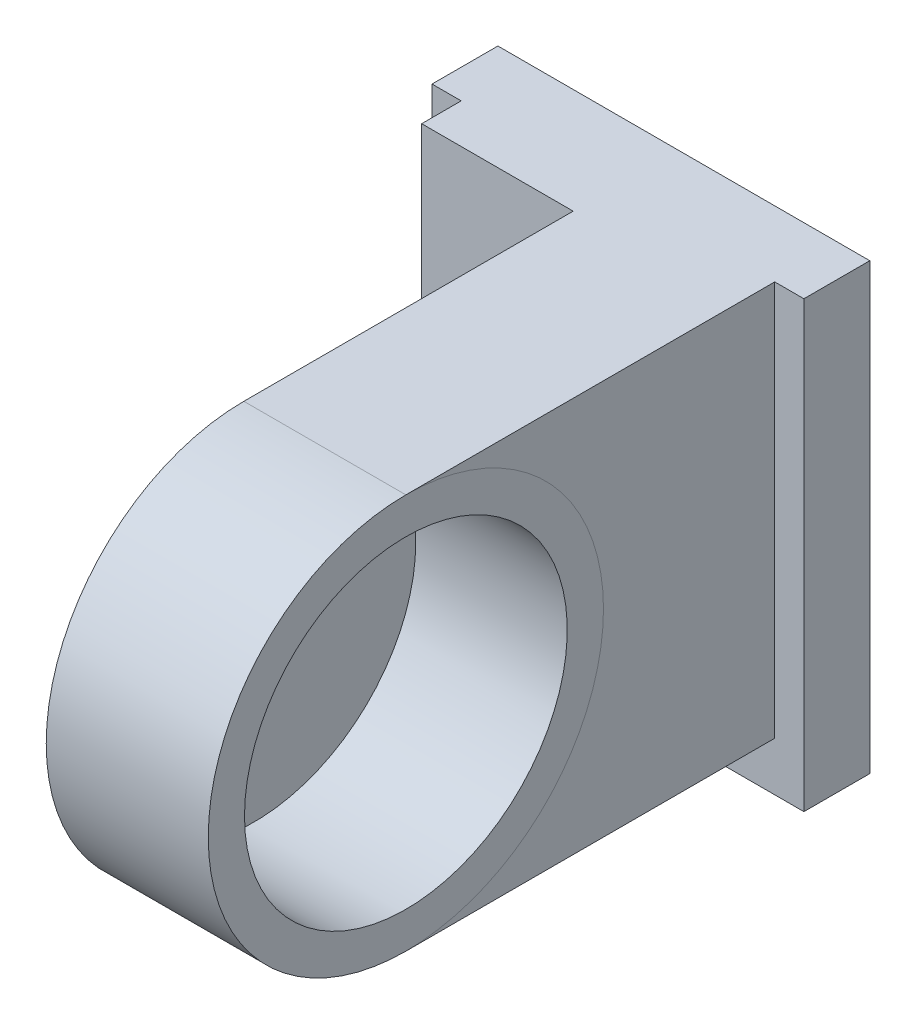
ISO-10303-21;
HEADER;
FILE_DESCRIPTION(('STEP AP214'),'2;1');
FILE_NAME('part.step','',(''),(''),'','','');
FILE_SCHEMA(('AUTOMOTIVE_DESIGN { 1 0 10303 214 1 1 1 1 }'));
ENDSEC;
DATA;
#1=APPLICATION_CONTEXT('core data for automotive mechanical design processes');
#2=APPLICATION_PROTOCOL_DEFINITION('international standard','automotive_design',2000,#1);
#3=PRODUCT_CONTEXT('',#1,'mechanical');
#4=PRODUCT('Part','Part','',(#3));
#5=PRODUCT_RELATED_PRODUCT_CATEGORY('part','',(#4));
#6=PRODUCT_DEFINITION_FORMATION('','',#4);
#7=PRODUCT_DEFINITION_CONTEXT('part definition',#1,'design');
#8=PRODUCT_DEFINITION('design','',#6,#7);
#9=PRODUCT_DEFINITION_SHAPE('','',#8);
#10=(LENGTH_UNIT() NAMED_UNIT(*) SI_UNIT(.MILLI.,.METRE.));
#11=(NAMED_UNIT(*) PLANE_ANGLE_UNIT() SI_UNIT($,.RADIAN.));
#12=(NAMED_UNIT(*) SI_UNIT($,.STERADIAN.) SOLID_ANGLE_UNIT());
#13=UNCERTAINTY_MEASURE_WITH_UNIT(LENGTH_MEASURE(1.E-05),#10,'distance_accuracy_value','');
#14=(GEOMETRIC_REPRESENTATION_CONTEXT(3) GLOBAL_UNCERTAINTY_ASSIGNED_CONTEXT((#13)) GLOBAL_UNIT_ASSIGNED_CONTEXT((#10,
#11,#12)) REPRESENTATION_CONTEXT('',''));
#15=CARTESIAN_POINT('',(0.,0.,0.));
#16=DIRECTION('',(0.,0.,1.));
#17=DIRECTION('',(1.,0.,0.));
#18=AXIS2_PLACEMENT_3D('',#15,#16,#17);
#19=CARTESIAN_POINT('',(23.8,15.,-30.));
#20=DIRECTION('',(-1.,0.,0.));
#21=DIRECTION('',(0.,0.,1.));
#22=AXIS2_PLACEMENT_3D('',#19,#20,#21);
#23=PLANE('',#22);
#24=DIRECTION('',(0.,-1.,0.));
#25=VECTOR('',#24,1.);
#26=CARTESIAN_POINT('',(23.8,15.,-28.));
#27=LINE('',#26,#25);
#28=CARTESIAN_POINT('',(23.8,15.,-28.));
#29=VERTEX_POINT('',#28);
#30=CARTESIAN_POINT('',(23.8,-15.,-28.));
#31=VERTEX_POINT('',#30);
#32=EDGE_CURVE('E353',#29,#31,#27,.T.);
#33=ORIENTED_EDGE('',*,*,#32,.F.);
#34=DIRECTION('',(0.,0.,1.));
#35=VECTOR('',#34,1.);
#36=CARTESIAN_POINT('',(23.8,15.,-30.));
#37=LINE('',#36,#35);
#38=CARTESIAN_POINT('',(23.8,15.,0.));
#39=VERTEX_POINT('',#38);
#40=EDGE_CURVE('E199',#29,#39,#37,.T.);
#41=ORIENTED_EDGE('',*,*,#40,.T.);
#42=CARTESIAN_POINT('',(23.8,0.,0.));
#43=DIRECTION('',(1.,0.,0.));
#44=DIRECTION('',(0.,0.,-1.));
#45=AXIS2_PLACEMENT_3D('',#42,#43,#44);
#46=CIRCLE('',#45,15.);
#47=CARTESIAN_POINT('',(23.8,-15.,0.));
#48=VERTEX_POINT('',#47);
#49=EDGE_CURVE('E188',#39,#48,#46,.F.);
#50=ORIENTED_EDGE('',*,*,#49,.T.);
#51=DIRECTION('',(0.,0.,1.));
#52=VECTOR('',#51,1.);
#53=CARTESIAN_POINT('',(23.8,-15.,-30.));
#54=LINE('',#53,#52);
#55=EDGE_CURVE('E190',#31,#48,#54,.T.);
#56=ORIENTED_EDGE('',*,*,#55,.F.);
#57=EDGE_LOOP('',(#33,#41,#50,#56));
#58=FACE_BOUND('',#57,.T.);
#59=ADVANCED_FACE('F49',(#58),#23,.F.);
#60=CARTESIAN_POINT('',(0.,-15.,-30.));
#61=DIRECTION('',(1.,0.,0.));
#62=DIRECTION('',(0.,0.,-1.));
#63=AXIS2_PLACEMENT_3D('',#60,#61,#62);
#64=PLANE('',#63);
#65=DIRECTION('',(0.,0.,1.));
#66=VECTOR('',#65,1.);
#67=CARTESIAN_POINT('',(0.,-15.,-30.));
#68=LINE('',#67,#66);
#69=CARTESIAN_POINT('',(0.,-15.,-28.));
#70=VERTEX_POINT('',#69);
#71=CARTESIAN_POINT('',(0.,-15.,-25.));
#72=VERTEX_POINT('',#71);
#73=EDGE_CURVE('E182',#70,#72,#68,.T.);
#74=ORIENTED_EDGE('',*,*,#73,.T.);
#75=DIRECTION('',(0.,-1.,0.));
#76=VECTOR('',#75,1.);
#77=CARTESIAN_POINT('',(0.,15.,-25.));
#78=LINE('',#77,#76);
#79=CARTESIAN_POINT('',(0.,15.,-25.));
#80=VERTEX_POINT('',#79);
#81=EDGE_CURVE('E167',#80,#72,#78,.T.);
#82=ORIENTED_EDGE('',*,*,#81,.F.);
#83=DIRECTION('',(0.,0.,1.));
#84=VECTOR('',#83,1.);
#85=CARTESIAN_POINT('',(0.,15.,-30.));
#86=LINE('',#85,#84);
#87=CARTESIAN_POINT('',(0.,15.,-28.));
#88=VERTEX_POINT('',#87);
#89=EDGE_CURVE('E180',#88,#80,#86,.T.);
#90=ORIENTED_EDGE('',*,*,#89,.F.);
#91=DIRECTION('',(0.,1.,0.));
#92=VECTOR('',#91,1.);
#93=CARTESIAN_POINT('',(0.,-15.,-28.));
#94=LINE('',#93,#92);
#95=EDGE_CURVE('E202',#70,#88,#94,.T.);
#96=ORIENTED_EDGE('',*,*,#95,.F.);
#97=EDGE_LOOP('',(#74,#82,#90,#96));
#98=FACE_BOUND('',#97,.T.);
#99=ADVANCED_FACE('F179',(#98),#64,.F.);
#100=CARTESIAN_POINT('',(23.8,-15.,-30.));
#101=DIRECTION('',(0.,1.,0.));
#102=DIRECTION('',(0.,0.,1.));
#103=AXIS2_PLACEMENT_3D('',#100,#101,#102);
#104=PLANE('',#103);
#105=DIRECTION('',(-1.,0.,0.));
#106=VECTOR('',#105,1.);
#107=CARTESIAN_POINT('',(4.,-15.,0.));
#108=LINE('',#107,#106);
#109=CARTESIAN_POINT('',(11.5,-15.,0.));
#110=VERTEX_POINT('',#109);
#111=EDGE_CURVE('E356',#110,#48,#108,.F.);
#112=ORIENTED_EDGE('',*,*,#111,.F.);
#113=DIRECTION('',(0.,0.,1.));
#114=VECTOR('',#113,1.);
#115=CARTESIAN_POINT('',(11.5,-15.,-25.));
#116=LINE('',#115,#114);
#117=CARTESIAN_POINT('',(11.5,-15.,-25.));
#118=VERTEX_POINT('',#117);
#119=EDGE_CURVE('E64',#118,#110,#116,.T.);
#120=ORIENTED_EDGE('',*,*,#119,.F.);
#121=DIRECTION('',(-1.,0.,0.));
#122=VECTOR('',#121,1.);
#123=CARTESIAN_POINT('',(62.9508707321241,-15.,-25.));
#124=LINE('',#123,#122);
#125=EDGE_CURVE('E219',#118,#72,#124,.T.);
#126=ORIENTED_EDGE('',*,*,#125,.T.);
#127=ORIENTED_EDGE('',*,*,#73,.F.);
#128=DIRECTION('',(-1.,0.,0.));
#129=VECTOR('',#128,1.);
#130=CARTESIAN_POINT('',(23.8,-15.,-28.));
#131=LINE('',#130,#129);
#132=EDGE_CURVE('E349',#31,#70,#131,.T.);
#133=ORIENTED_EDGE('',*,*,#132,.F.);
#134=ORIENTED_EDGE('',*,*,#55,.T.);
#135=EDGE_LOOP('',(#112,#120,#126,#127,#133,#134));
#136=FACE_BOUND('',#135,.T.);
#137=ADVANCED_FACE('F252',(#136),#104,.F.);
#138=CARTESIAN_POINT('',(23.8,15.,-30.));
#139=DIRECTION('',(0.,-1.,0.));
#140=DIRECTION('',(0.,0.,-1.));
#141=AXIS2_PLACEMENT_3D('',#138,#139,#140);
#142=PLANE('',#141);
#143=DIRECTION('',(-1.,0.,0.));
#144=VECTOR('',#143,1.);
#145=CARTESIAN_POINT('',(62.9508707321241,15.,-25.));
#146=LINE('',#145,#144);
#147=CARTESIAN_POINT('',(11.5,15.,-25.));
#148=VERTEX_POINT('',#147);
#149=EDGE_CURVE('E164',#148,#80,#146,.T.);
#150=ORIENTED_EDGE('',*,*,#149,.F.);
#151=DIRECTION('',(0.,0.,-1.));
#152=VECTOR('',#151,1.);
#153=CARTESIAN_POINT('',(11.5,15.,-25.));
#154=LINE('',#153,#152);
#155=CARTESIAN_POINT('',(11.5,15.,0.));
#156=VERTEX_POINT('',#155);
#157=EDGE_CURVE('E174',#156,#148,#154,.T.);
#158=ORIENTED_EDGE('',*,*,#157,.F.);
#159=DIRECTION('',(-1.,0.,0.));
#160=VECTOR('',#159,1.);
#161=CARTESIAN_POINT('',(4.,15.,0.));
#162=LINE('',#161,#160);
#163=EDGE_CURVE('E193',#156,#39,#162,.F.);
#164=ORIENTED_EDGE('',*,*,#163,.T.);
#165=ORIENTED_EDGE('',*,*,#40,.F.);
#166=DIRECTION('',(-1.,0.,0.));
#167=VECTOR('',#166,1.);
#168=CARTESIAN_POINT('',(23.8,15.,-28.));
#169=LINE('',#168,#167);
#170=CARTESIAN_POINT('',(26.0140137299771,15.,-28.));
#171=VERTEX_POINT('',#170);
#172=EDGE_CURVE('E312',#171,#29,#169,.T.);
#173=ORIENTED_EDGE('',*,*,#172,.F.);
#174=DIRECTION('',(0.,0.,1.));
#175=VECTOR('',#174,1.);
#176=CARTESIAN_POINT('',(26.0140137299771,15.,-28.));
#177=LINE('',#176,#175);
#178=CARTESIAN_POINT('',(26.0140137299771,15.,-33.));
#179=VERTEX_POINT('',#178);
#180=EDGE_CURVE('E309',#179,#171,#177,.T.);
#181=ORIENTED_EDGE('',*,*,#180,.F.);
#182=DIRECTION('',(1.,0.,0.));
#183=VECTOR('',#182,1.);
#184=CARTESIAN_POINT('',(26.0140137299771,15.,-33.));
#185=LINE('',#184,#183);
#186=CARTESIAN_POINT('',(-2.21401372997711,15.,-33.));
#187=VERTEX_POINT('',#186);
#188=EDGE_CURVE('E302',#187,#179,#185,.T.);
#189=ORIENTED_EDGE('',*,*,#188,.F.);
#190=DIRECTION('',(0.,0.,-1.));
#191=VECTOR('',#190,1.);
#192=CARTESIAN_POINT('',(-2.21401372997711,15.,-33.));
#193=LINE('',#192,#191);
#194=CARTESIAN_POINT('',(-2.21401372997711,15.,-28.));
#195=VERTEX_POINT('',#194);
#196=EDGE_CURVE('E316',#195,#187,#193,.T.);
#197=ORIENTED_EDGE('',*,*,#196,.F.);
#198=DIRECTION('',(-1.,0.,0.));
#199=VECTOR('',#198,1.);
#200=CARTESIAN_POINT('',(-2.21401372997711,15.,-28.));
#201=LINE('',#200,#199);
#202=EDGE_CURVE('E187',#88,#195,#201,.T.);
#203=ORIENTED_EDGE('',*,*,#202,.F.);
#204=ORIENTED_EDGE('',*,*,#89,.T.);
#205=EDGE_LOOP('',(#150,#158,#164,#165,#173,#181,#189,#197,#203,#204));
#206=FACE_BOUND('',#205,.T.);
#207=ADVANCED_FACE('F51',(#206),#142,.F.);
#208=CARTESIAN_POINT('',(4.,0.,0.));
#209=DIRECTION('',(-1.,0.,0.));
#210=DIRECTION('',(0.,0.,1.));
#211=AXIS2_PLACEMENT_3D('',#208,#209,#210);
#212=CYLINDRICAL_SURFACE('',#211,15.);
#213=CARTESIAN_POINT('',(11.5,0.,0.));
#214=DIRECTION('',(1.,0.,0.));
#215=DIRECTION('',(0.,0.,-1.));
#216=AXIS2_PLACEMENT_3D('',#213,#214,#215);
#217=CIRCLE('',#216,15.);
#218=EDGE_CURVE('E218',#110,#156,#217,.T.);
#219=ORIENTED_EDGE('',*,*,#218,.F.);
#220=ORIENTED_EDGE('',*,*,#111,.T.);
#221=ORIENTED_EDGE('',*,*,#49,.F.);
#222=ORIENTED_EDGE('',*,*,#163,.F.);
#223=EDGE_LOOP('',(#219,#220,#221,#222));
#224=FACE_BOUND('',#223,.T.);
#225=ADVANCED_FACE('F258',(#224),#212,.F.);
#226=CARTESIAN_POINT('',(0.,0.,-28.));
#227=DIRECTION('',(0.,0.,-1.));
#228=DIRECTION('',(-1.,0.,0.));
#229=AXIS2_PLACEMENT_3D('',#226,#227,#228);
#230=PLANE('',#229);
#231=DIRECTION('',(0.,-1.,0.));
#232=VECTOR('',#231,1.);
#233=CARTESIAN_POINT('',(26.0140137299771,6.72036613272311,-28.));
#234=LINE('',#233,#232);
#235=CARTESIAN_POINT('',(26.0140137299771,-18.7203661327231,-28.));
#236=VERTEX_POINT('',#235);
#237=EDGE_CURVE('E337',#171,#236,#234,.T.);
#238=ORIENTED_EDGE('',*,*,#237,.F.);
#239=ORIENTED_EDGE('',*,*,#172,.T.);
#240=ORIENTED_EDGE('',*,*,#32,.T.);
#241=ORIENTED_EDGE('',*,*,#132,.T.);
#242=ORIENTED_EDGE('',*,*,#95,.T.);
#243=ORIENTED_EDGE('',*,*,#202,.T.);
#244=DIRECTION('',(0.,1.,0.));
#245=VECTOR('',#244,1.);
#246=CARTESIAN_POINT('',(-2.21401372997711,6.72036613272311,-28.));
#247=LINE('',#246,#245);
#248=CARTESIAN_POINT('',(-2.21401372997712,-18.7203661327231,-28.));
#249=VERTEX_POINT('',#248);
#250=EDGE_CURVE('E343',#249,#195,#247,.T.);
#251=ORIENTED_EDGE('',*,*,#250,.F.);
#252=DIRECTION('',(-1.,0.,0.));
#253=VECTOR('',#252,1.);
#254=CARTESIAN_POINT('',(26.0140137299771,-18.7203661327231,-28.));
#255=LINE('',#254,#253);
#256=EDGE_CURVE('E340',#236,#249,#255,.T.);
#257=ORIENTED_EDGE('',*,*,#256,.F.);
#258=EDGE_LOOP('',(#238,#239,#240,#241,#242,#243,#251,#257));
#259=FACE_BOUND('',#258,.T.);
#260=ADVANCED_FACE('F261',(#259),#230,.F.);
#261=CARTESIAN_POINT('',(26.0140137299771,6.72036613272311,-28.));
#262=DIRECTION('',(1.,0.,0.));
#263=DIRECTION('',(0.,1.,0.));
#264=AXIS2_PLACEMENT_3D('',#261,#262,#263);
#265=PLANE('',#264);
#266=DIRECTION('',(0.,0.,-1.));
#267=VECTOR('',#266,1.);
#268=CARTESIAN_POINT('',(26.0140137299771,-18.7203661327231,-28.));
#269=LINE('',#268,#267);
#270=CARTESIAN_POINT('',(26.0140137299771,-18.7203661327231,-33.));
#271=VERTEX_POINT('',#270);
#272=EDGE_CURVE('E345',#236,#271,#269,.T.);
#273=ORIENTED_EDGE('',*,*,#272,.T.);
#274=DIRECTION('',(0.,-1.,0.));
#275=VECTOR('',#274,1.);
#276=CARTESIAN_POINT('',(26.0140137299771,6.72036613272311,-33.));
#277=LINE('',#276,#275);
#278=EDGE_CURVE('E326',#179,#271,#277,.T.);
#279=ORIENTED_EDGE('',*,*,#278,.F.);
#280=ORIENTED_EDGE('',*,*,#180,.T.);
#281=ORIENTED_EDGE('',*,*,#237,.T.);
#282=EDGE_LOOP('',(#273,#279,#280,#281));
#283=FACE_BOUND('',#282,.T.);
#284=ADVANCED_FACE('F263',(#283),#265,.T.);
#285=CARTESIAN_POINT('',(-2.21401372997711,6.72036613272311,-28.));
#286=DIRECTION('',(-1.,0.,0.));
#287=DIRECTION('',(0.,-1.,0.));
#288=AXIS2_PLACEMENT_3D('',#285,#286,#287);
#289=PLANE('',#288);
#290=DIRECTION('',(0.,-1.,0.));
#291=VECTOR('',#290,1.);
#292=CARTESIAN_POINT('',(-2.21401372997712,4.72036613272311,-30.));
#293=LINE('',#292,#291);
#294=CARTESIAN_POINT('',(-2.21401372997712,4.72036613272311,-30.));
#295=VERTEX_POINT('',#294);
#296=CARTESIAN_POINT('',(-2.21401372997712,-18.7203661327231,-30.));
#297=VERTEX_POINT('',#296);
#298=EDGE_CURVE('E381',#295,#297,#293,.T.);
#299=ORIENTED_EDGE('',*,*,#298,.T.);
#300=DIRECTION('',(0.,0.,-1.));
#301=VECTOR('',#300,1.);
#302=CARTESIAN_POINT('',(-2.21401372997712,-18.7203661327231,-28.));
#303=LINE('',#302,#301);
#304=EDGE_CURVE('E346',#249,#297,#303,.T.);
#305=ORIENTED_EDGE('',*,*,#304,.F.);
#306=ORIENTED_EDGE('',*,*,#250,.T.);
#307=ORIENTED_EDGE('',*,*,#196,.T.);
#308=DIRECTION('',(0.,1.,0.));
#309=VECTOR('',#308,1.);
#310=CARTESIAN_POINT('',(-2.21401372997711,6.72036613272311,-33.));
#311=LINE('',#310,#309);
#312=CARTESIAN_POINT('',(-2.21401372997712,4.72036613272311,-33.));
#313=VERTEX_POINT('',#312);
#314=EDGE_CURVE('E335',#313,#187,#311,.T.);
#315=ORIENTED_EDGE('',*,*,#314,.F.);
#316=DIRECTION('',(0.,0.,1.));
#317=VECTOR('',#316,1.);
#318=CARTESIAN_POINT('',(-2.21401372997712,4.72036613272311,-33.));
#319=LINE('',#318,#317);
#320=EDGE_CURVE('E377',#313,#295,#319,.T.);
#321=ORIENTED_EDGE('',*,*,#320,.T.);
#322=EDGE_LOOP('',(#299,#305,#306,#307,#315,#321));
#323=FACE_BOUND('',#322,.T.);
#324=ADVANCED_FACE('F266',(#323),#289,.T.);
#325=CARTESIAN_POINT('',(26.0140137299771,-18.7203661327231,-28.));
#326=DIRECTION('',(0.,-1.,0.));
#327=DIRECTION('',(0.,0.,-1.));
#328=AXIS2_PLACEMENT_3D('',#325,#326,#327);
#329=PLANE('',#328);
#330=DIRECTION('',(0.,0.,-1.));
#331=VECTOR('',#330,1.);
#332=CARTESIAN_POINT('',(24.0140137299771,-18.7203661327231,-30.));
#333=LINE('',#332,#331);
#334=CARTESIAN_POINT('',(24.0140137299771,-18.7203661327231,-30.));
#335=VERTEX_POINT('',#334);
#336=CARTESIAN_POINT('',(24.0140137299771,-18.7203661327231,-33.));
#337=VERTEX_POINT('',#336);
#338=EDGE_CURVE('E221',#335,#337,#333,.T.);
#339=ORIENTED_EDGE('',*,*,#338,.T.);
#340=DIRECTION('',(-1.,0.,0.));
#341=VECTOR('',#340,1.);
#342=CARTESIAN_POINT('',(26.0140137299771,-18.7203661327231,-33.));
#343=LINE('',#342,#341);
#344=EDGE_CURVE('E332',#271,#337,#343,.T.);
#345=ORIENTED_EDGE('',*,*,#344,.F.);
#346=ORIENTED_EDGE('',*,*,#272,.F.);
#347=ORIENTED_EDGE('',*,*,#256,.T.);
#348=ORIENTED_EDGE('',*,*,#304,.T.);
#349=DIRECTION('',(1.,0.,0.));
#350=VECTOR('',#349,1.);
#351=CARTESIAN_POINT('',(-2.21401372997712,-18.7203661327231,-30.));
#352=LINE('',#351,#350);
#353=EDGE_CURVE('E375',#297,#335,#352,.T.);
#354=ORIENTED_EDGE('',*,*,#353,.T.);
#355=EDGE_LOOP('',(#339,#345,#346,#347,#348,#354));
#356=FACE_BOUND('',#355,.T.);
#357=ADVANCED_FACE('F268',(#356),#329,.T.);
#358=CARTESIAN_POINT('',(0.,0.,-33.));
#359=DIRECTION('',(0.,0.,-1.));
#360=DIRECTION('',(-1.,0.,0.));
#361=AXIS2_PLACEMENT_3D('',#358,#359,#360);
#362=PLANE('',#361);
#363=ORIENTED_EDGE('',*,*,#344,.T.);
#364=DIRECTION('',(0.,-1.,0.));
#365=VECTOR('',#364,1.);
#366=CARTESIAN_POINT('',(24.0140137299771,4.72036613272311,-33.));
#367=LINE('',#366,#365);
#368=CARTESIAN_POINT('',(24.0140137299771,3.72036613272311,-33.));
#369=VERTEX_POINT('',#368);
#370=EDGE_CURVE('E324',#369,#337,#367,.T.);
#371=ORIENTED_EDGE('',*,*,#370,.F.);
#372=CARTESIAN_POINT('',(24.0140137299771,4.72036613272311,-33.));
#373=DIRECTION('',(0.,0.,-1.));
#374=DIRECTION('',(-1.,0.,0.));
#375=AXIS2_PLACEMENT_3D('',#372,#373,#374);
#376=CIRCLE('',#375,1.);
#377=CARTESIAN_POINT('',(23.0140137299771,4.72036613272311,-33.));
#378=VERTEX_POINT('',#377);
#379=EDGE_CURVE('E383',#378,#369,#376,.T.);
#380=ORIENTED_EDGE('',*,*,#379,.F.);
#381=DIRECTION('',(1.,0.,0.));
#382=VECTOR('',#381,1.);
#383=CARTESIAN_POINT('',(-0.214013729977118,4.72036613272311,-33.));
#384=LINE('',#383,#382);
#385=EDGE_CURVE('E319',#313,#378,#384,.T.);
#386=ORIENTED_EDGE('',*,*,#385,.F.);
#387=ORIENTED_EDGE('',*,*,#314,.T.);
#388=ORIENTED_EDGE('',*,*,#188,.T.);
#389=ORIENTED_EDGE('',*,*,#278,.T.);
#390=EDGE_LOOP('',(#363,#371,#380,#386,#387,#388,#389));
#391=FACE_BOUND('',#390,.T.);
#392=ADVANCED_FACE('F271',(#391),#362,.T.);
#393=CARTESIAN_POINT('',(-0.214013729977118,4.72036613272311,-30.));
#394=DIRECTION('',(0.,1.,0.));
#395=DIRECTION('',(0.,0.,1.));
#396=AXIS2_PLACEMENT_3D('',#393,#394,#395);
#397=PLANE('',#396);
#398=ORIENTED_EDGE('',*,*,#385,.T.);
#399=DIRECTION('',(0.,0.,-1.));
#400=VECTOR('',#399,1.);
#401=CARTESIAN_POINT('',(23.0140137299771,4.72036613272311,-27.1715728752538));
#402=LINE('',#401,#400);
#403=CARTESIAN_POINT('',(23.0140137299771,4.72036613272311,-30.));
#404=VERTEX_POINT('',#403);
#405=EDGE_CURVE('E300',#378,#404,#402,.F.);
#406=ORIENTED_EDGE('',*,*,#405,.T.);
#407=DIRECTION('',(1.,0.,0.));
#408=VECTOR('',#407,1.);
#409=CARTESIAN_POINT('',(-0.214013729977118,4.72036613272311,-30.));
#410=LINE('',#409,#408);
#411=EDGE_CURVE('E296',#295,#404,#410,.T.);
#412=ORIENTED_EDGE('',*,*,#411,.F.);
#413=ORIENTED_EDGE('',*,*,#320,.F.);
#414=EDGE_LOOP('',(#398,#406,#412,#413));
#415=FACE_BOUND('',#414,.T.);
#416=ADVANCED_FACE('F281',(#415),#397,.F.);
#417=CARTESIAN_POINT('',(24.0140137299771,4.72036613272311,-30.));
#418=DIRECTION('',(1.,0.,0.));
#419=DIRECTION('',(0.,0.,-1.));
#420=AXIS2_PLACEMENT_3D('',#417,#418,#419);
#421=PLANE('',#420);
#422=DIRECTION('',(0.,-1.,0.));
#423=VECTOR('',#422,1.);
#424=CARTESIAN_POINT('',(24.0140137299771,4.72036613272311,-30.));
#425=LINE('',#424,#423);
#426=CARTESIAN_POINT('',(24.0140137299771,3.72036613272311,-30.));
#427=VERTEX_POINT('',#426);
#428=EDGE_CURVE('E323',#427,#335,#425,.T.);
#429=ORIENTED_EDGE('',*,*,#428,.F.);
#430=DIRECTION('',(0.,0.,-1.));
#431=VECTOR('',#430,1.);
#432=CARTESIAN_POINT('',(24.0140137299771,3.72036613272311,-27.1715728752538));
#433=LINE('',#432,#431);
#434=EDGE_CURVE('E305',#427,#369,#433,.T.);
#435=ORIENTED_EDGE('',*,*,#434,.T.);
#436=ORIENTED_EDGE('',*,*,#370,.T.);
#437=ORIENTED_EDGE('',*,*,#338,.F.);
#438=EDGE_LOOP('',(#429,#435,#436,#437));
#439=FACE_BOUND('',#438,.T.);
#440=ADVANCED_FACE('F285',(#439),#421,.F.);
#441=CARTESIAN_POINT('',(0.,0.,-30.));
#442=DIRECTION('',(0.,0.,-1.));
#443=DIRECTION('',(-1.,0.,0.));
#444=AXIS2_PLACEMENT_3D('',#441,#442,#443);
#445=PLANE('',#444);
#446=ORIENTED_EDGE('',*,*,#411,.T.);
#447=CARTESIAN_POINT('',(24.0140137299771,4.72036613272311,-30.));
#448=DIRECTION('',(0.,0.,-1.));
#449=DIRECTION('',(-1.,0.,0.));
#450=AXIS2_PLACEMENT_3D('',#447,#448,#449);
#451=CIRCLE('',#450,1.);
#452=EDGE_CURVE('E385',#427,#404,#451,.F.);
#453=ORIENTED_EDGE('',*,*,#452,.F.);
#454=ORIENTED_EDGE('',*,*,#428,.T.);
#455=ORIENTED_EDGE('',*,*,#353,.F.);
#456=ORIENTED_EDGE('',*,*,#298,.F.);
#457=EDGE_LOOP('',(#446,#453,#454,#455,#456));
#458=FACE_BOUND('',#457,.T.);
#459=CARTESIAN_POINT('',(11.9,-5.99999999999999,-30.));
#460=DIRECTION('',(0.,0.,-1.));
#461=DIRECTION('',(-1.,0.,0.));
#462=AXIS2_PLACEMENT_3D('',#459,#460,#461);
#463=CIRCLE('',#462,1.64999999999999);
#464=CARTESIAN_POINT('',(10.25,-5.99999999999999,-30.));
#465=VERTEX_POINT('',#464);
#466=EDGE_CURVE('E299',#465,#465,#463,.T.);
#467=ORIENTED_EDGE('',*,*,#466,.F.);
#468=EDGE_LOOP('',(#467));
#469=FACE_BOUND('',#468,.T.);
#470=ADVANCED_FACE('F245',(#458,#469),#445,.T.);
#471=CARTESIAN_POINT('',(11.9,-5.99999999999999,-19.9));
#472=DIRECTION('',(0.,0.,-1.));
#473=DIRECTION('',(-1.,0.,0.));
#474=AXIS2_PLACEMENT_3D('',#471,#472,#473);
#475=CONICAL_SURFACE('',#474,1.65,1.02974425867665);
#476=CARTESIAN_POINT('',(11.9,-5.99999999999999,-18.9085799786045));
#477=VERTEX_POINT('',#476);
#478=VERTEX_LOOP('',#477);
#479=FACE_BOUND('',#478,.T.);
#480=CARTESIAN_POINT('',(11.9,-5.99999999999999,-19.9));
#481=DIRECTION('',(0.,0.,-1.));
#482=DIRECTION('',(-1.,0.,0.));
#483=AXIS2_PLACEMENT_3D('',#480,#481,#482);
#484=CIRCLE('',#483,1.65);
#485=CARTESIAN_POINT('',(11.5,-4.39921894064179,-19.9));
#486=VERTEX_POINT('',#485);
#487=CARTESIAN_POINT('',(11.5,-7.6007810593582,-19.9));
#488=VERTEX_POINT('',#487);
#489=EDGE_CURVE('E212',#486,#488,#484,.T.);
#490=ORIENTED_EDGE('',*,*,#489,.T.);
#491=CARTESIAN_POINT('',(11.5,-11.0959094565305,-21.9799296343655));
#492=CARTESIAN_POINT('',(11.5,-10.8899420835726,-21.8565564729114));
#493=CARTESIAN_POINT('',(11.5,-10.6839587088977,-21.733210007237));
#494=CARTESIAN_POINT('',(11.5,-10.2719303982469,-21.486617523826));
#495=CARTESIAN_POINT('',(11.5,-10.0658854619575,-21.3633715066133));
#496=CARTESIAN_POINT('',(11.5,-9.65372006695948,-21.1170363022598));
#497=CARTESIAN_POINT('',(11.5,-9.44759961406344,-20.9939471054002));
#498=CARTESIAN_POINT('',(11.5,-9.0352078331686,-20.7480237630582));
#499=CARTESIAN_POINT('',(11.5,-8.82893650579443,-20.6251896165278));
#500=CARTESIAN_POINT('',(11.5,-8.40836563956159,-20.3753595928371));
#501=CARTESIAN_POINT('',(11.5,-8.19405586435979,-20.2483808968517));
#502=CARTESIAN_POINT('',(11.5,-7.87207777430335,-20.0587604916527));
#503=CARTESIAN_POINT('',(11.5,-7.76466097189649,-19.9956919369952));
#504=CARTESIAN_POINT('',(11.5,-7.54954691974332,-19.8700391825605));
#505=CARTESIAN_POINT('',(11.5,-7.44184967674577,-19.8074549712689));
#506=CARTESIAN_POINT('',(11.5,-7.2772832350475,-19.7127450287922));
#507=CARTESIAN_POINT('',(11.5,-7.22060323403768,-19.6802908538735));
#508=CARTESIAN_POINT('',(11.5,-7.10703240582595,-19.6157539159112));
#509=CARTESIAN_POINT('',(11.5,-7.05014158097183,-19.5836711487478));
#510=CARTESIAN_POINT('',(11.5,-6.93604242945231,-19.520078151245));
#511=CARTESIAN_POINT('',(11.5,-6.87883411152538,-19.4885679052489));
#512=CARTESIAN_POINT('',(11.5,-6.76391771442571,-19.4264802546729));
#513=CARTESIAN_POINT('',(11.5,-6.70620970266667,-19.3959027267017));
#514=CARTESIAN_POINT('',(11.5,-6.61631789788722,-19.3499469450673));
#515=CARTESIAN_POINT('',(11.5,-6.58444119824733,-19.3339709930333));
#516=CARTESIAN_POINT('',(11.5,-6.52032583255704,-19.302765974528));
#517=CARTESIAN_POINT('',(11.5,-6.48808719565185,-19.2875368484408));
#518=CARTESIAN_POINT('',(11.5,-6.42301234121299,-19.2581532564803));
#519=CARTESIAN_POINT('',(11.5,-6.39017478301928,-19.2440017007919));
#520=CARTESIAN_POINT('',(11.5,-6.32381470865599,-19.2174481274386));
#521=CARTESIAN_POINT('',(11.5,-6.29029247236088,-19.2050454106654));
#522=CARTESIAN_POINT('',(11.5,-6.21334346956224,-19.1801090293932));
#523=CARTESIAN_POINT('',(11.5,-6.16962444187895,-19.1683937790061));
#524=CARTESIAN_POINT('',(11.5,-6.10322348071672,-19.1564789061711));
#525=CARTESIAN_POINT('',(11.5,-6.08105883576431,-19.1534514593982));
#526=CARTESIAN_POINT('',(11.5,-6.03653870711945,-19.1495626189115));
#527=CARTESIAN_POINT('',(11.5,-6.01418328082353,-19.1487005952862));
#528=CARTESIAN_POINT('',(11.5,-5.96940982315351,-19.1492489325821));
#529=CARTESIAN_POINT('',(11.5,-5.94699191138099,-19.1506686339729));
#530=CARTESIAN_POINT('',(11.5,-5.90238935836394,-19.1556250833057));
#531=CARTESIAN_POINT('',(11.5,-5.88020483211097,-19.1591628292919));
#532=CARTESIAN_POINT('',(11.5,-5.83595331136222,-19.1680446685122));
#533=CARTESIAN_POINT('',(11.5,-5.81389038042621,-19.1734084487115));
#534=CARTESIAN_POINT('',(11.5,-5.77015983881541,-19.18553131197));
#535=CARTESIAN_POINT('',(11.5,-5.74849222958235,-19.1922904001167));
#536=CARTESIAN_POINT('',(11.5,-5.6818313040473,-19.2148563835935));
#537=CARTESIAN_POINT('',(11.5,-5.63744320467461,-19.2324264374258));
#538=CARTESIAN_POINT('',(11.5,-5.54970471151687,-19.2700119706729));
#539=CARTESIAN_POINT('',(11.5,-5.50635560147531,-19.2900303058485));
#540=CARTESIAN_POINT('',(11.5,-5.42022328204225,-19.3315276174584));
#541=CARTESIAN_POINT('',(11.5,-5.37744188456341,-19.3530103373799));
#542=CARTESIAN_POINT('',(11.5,-5.29232419328212,-19.3968436883249));
#543=CARTESIAN_POINT('',(11.5,-5.24998795629457,-19.4191944284639));
#544=CARTESIAN_POINT('',(11.5,-5.12298455076178,-19.487301600781));
#545=CARTESIAN_POINT('',(11.5,-5.03876523015261,-19.5338902937822));
#546=CARTESIAN_POINT('',(11.5,-4.87107336171103,-19.628013256346));
#547=CARTESIAN_POINT('',(11.5,-4.78759970297044,-19.6755455714397));
#548=CARTESIAN_POINT('',(11.5,-4.62300458511196,-19.7700430945898));
#549=CARTESIAN_POINT('',(11.5,-4.54187505045948,-19.8169942286682));
#550=CARTESIAN_POINT('',(11.5,-4.37981684390112,-19.9112407623298));
#551=CARTESIAN_POINT('',(11.5,-4.29888817183315,-19.9585361616351));
#552=CARTESIAN_POINT('',(11.5,-4.05629199228427,-20.1007579593746));
#553=CARTESIAN_POINT('',(11.5,-3.89481954680061,-20.1960169326609));
#554=CARTESIAN_POINT('',(11.5,-3.57198435728776,-20.3870518193593));
#555=CARTESIAN_POINT('',(11.5,-3.41062184425889,-20.4828281221286));
#556=CARTESIAN_POINT('',(11.5,-3.08804892094551,-20.6746317952791));
#557=CARTESIAN_POINT('',(11.5,-2.92683850871474,-20.7706591623869));
#558=CARTESIAN_POINT('',(11.5,-2.61035724210898,-20.9593832943513));
#559=CARTESIAN_POINT('',(11.5,-2.45508307579562,-21.0520745087289));
#560=CARTESIAN_POINT('',(11.5,-2.14459267013447,-21.2375554158571));
#561=CARTESIAN_POINT('',(11.5,-1.98937643103819,-21.3303451090288));
#562=CARTESIAN_POINT('',(11.5,-1.67913120110516,-21.5159057041715));
#563=CARTESIAN_POINT('',(11.5,-1.52410217160733,-21.6086765415152));
#564=CARTESIAN_POINT('',(11.5,-1.21407553428509,-21.7942691111999));
#565=CARTESIAN_POINT('',(11.5,-1.05907792632128,-21.8870908433081));
#566=CARTESIAN_POINT('',(11.5,-0.904090543469489,-21.9799296343655));
#567=B_SPLINE_CURVE_WITH_KNOTS('',3,(#491,#492,#493,#494,#495,#496,#497,#498,#499,#500,#501,
#502,#503,#504,#505,#506,#507,#508,#509,#510,#511,#512,#513,#514,#515,#516,#517,#518,#519,#520,
#521,#522,#523,#524,#525,#526,#527,#528,#529,#530,#531,#532,#533,#534,#535,#536,#537,#538,#539,
#540,#541,#542,#543,#544,#545,#546,#547,#548,#549,#550,#551,#552,#553,#554,#555,#556,#557,#558,
#559,#560,#561,#562,#563,#564,#565,#566),.UNSPECIFIED.,.F.,.F.,(4,2,2,2,2,2,2,2,2,2,2,2,2,2,2,2,
2,2,2,2,2,2,2,2,2,2,2,2,2,2,2,2,2,2,2,2,2,4),(0.,0.720271801661051,1.44054733611591,
2.16077581960693,2.88100133802571,3.62830793810705,4.00199734207743,4.37567783488629,
4.57161851899064,4.76755702755778,4.96349016972436,5.15939727808679,5.26635859285771,
5.37331135541985,5.48054341105366,5.58773247778698,5.72302779964851,5.79004831565875,
5.8570493334564,5.92432532591329,5.99163304448157,6.05969069921125,6.12774860209784,
6.27079771803543,6.41401531197478,6.55761384600998,6.70123049004436,6.98994945397052,
7.27812250485975,7.55932823147494,7.84053373108577,8.40296284331975,8.96590021268225,
9.52883027835702,10.0713388168314,10.6138496840373,11.1558495395777,11.6978469357066),.UNSPECIFIED.);
#568=EDGE_CURVE('E215',#488,#486,#567,.T.);
#569=ORIENTED_EDGE('',*,*,#568,.T.);
#570=EDGE_LOOP('',(#490,#569));
#571=FACE_BOUND('',#570,.T.);
#572=ADVANCED_FACE('F217',(#479,#571),#475,.F.);
#573=CARTESIAN_POINT('',(11.9,-5.99999999999999,-30.));
#574=DIRECTION('',(0.,0.,-1.));
#575=DIRECTION('',(-1.,0.,0.));
#576=AXIS2_PLACEMENT_3D('',#573,#574,#575);
#577=CYLINDRICAL_SURFACE('',#576,1.64999999999999);
#578=CARTESIAN_POINT('',(11.9,-5.99999999999999,-25.));
#579=DIRECTION('',(0.,0.,-1.));
#580=DIRECTION('',(0.,1.,0.));
#581=AXIS2_PLACEMENT_3D('',#578,#579,#580);
#582=CIRCLE('',#581,1.64999999999999);
#583=CARTESIAN_POINT('',(11.5,-4.39921894064179,-25.));
#584=VERTEX_POINT('',#583);
#585=CARTESIAN_POINT('',(11.5,-7.6007810593582,-25.));
#586=VERTEX_POINT('',#585);
#587=EDGE_CURVE('E204',#584,#586,#582,.F.);
#588=ORIENTED_EDGE('',*,*,#587,.T.);
#589=DIRECTION('',(0.,0.,-1.));
#590=VECTOR('',#589,1.);
#591=CARTESIAN_POINT('',(11.5,-7.6007810593582,-30.));
#592=LINE('',#591,#590);
#593=EDGE_CURVE('E12',#586,#488,#592,.F.);
#594=ORIENTED_EDGE('',*,*,#593,.T.);
#595=ORIENTED_EDGE('',*,*,#489,.F.);
#596=DIRECTION('',(0.,0.,-1.));
#597=VECTOR('',#596,1.);
#598=CARTESIAN_POINT('',(11.5,-4.39921894064179,-30.));
#599=LINE('',#598,#597);
#600=EDGE_CURVE('E57',#486,#584,#599,.T.);
#601=ORIENTED_EDGE('',*,*,#600,.T.);
#602=EDGE_LOOP('',(#588,#594,#595,#601));
#603=FACE_BOUND('',#602,.T.);
#604=ORIENTED_EDGE('',*,*,#466,.T.);
#605=EDGE_LOOP('',(#604));
#606=FACE_BOUND('',#605,.T.);
#607=ADVANCED_FACE('F209',(#603,#606),#577,.F.);
#608=CARTESIAN_POINT('',(24.0140137299771,4.72036613272311,-27.1715728752538));
#609=DIRECTION('',(0.,0.,-1.));
#610=DIRECTION('',(-1.,0.,0.));
#611=AXIS2_PLACEMENT_3D('',#608,#609,#610);
#612=CYLINDRICAL_SURFACE('',#611,1.);
#613=ORIENTED_EDGE('',*,*,#379,.T.);
#614=ORIENTED_EDGE('',*,*,#434,.F.);
#615=ORIENTED_EDGE('',*,*,#452,.T.);
#616=ORIENTED_EDGE('',*,*,#405,.F.);
#617=EDGE_LOOP('',(#613,#614,#615,#616));
#618=FACE_BOUND('',#617,.T.);
#619=ADVANCED_FACE('F238',(#618),#612,.F.);
#620=CARTESIAN_POINT('',(11.5,0.,0.));
#621=DIRECTION('',(1.,0.,0.));
#622=DIRECTION('',(0.,0.,-1.));
#623=AXIS2_PLACEMENT_3D('',#620,#621,#622);
#624=PLANE('',#623);
#625=ORIENTED_EDGE('',*,*,#218,.T.);
#626=ORIENTED_EDGE('',*,*,#157,.T.);
#627=DIRECTION('',(0.,-1.,0.));
#628=VECTOR('',#627,1.);
#629=CARTESIAN_POINT('',(11.5,15.,-25.));
#630=LINE('',#629,#628);
#631=EDGE_CURVE('E170',#148,#584,#630,.T.);
#632=ORIENTED_EDGE('',*,*,#631,.T.);
#633=ORIENTED_EDGE('',*,*,#600,.F.);
#634=ORIENTED_EDGE('',*,*,#568,.F.);
#635=ORIENTED_EDGE('',*,*,#593,.F.);
#636=EDGE_CURVE('E71',#586,#118,#630,.T.);
#637=ORIENTED_EDGE('',*,*,#636,.T.);
#638=ORIENTED_EDGE('',*,*,#119,.T.);
#639=EDGE_LOOP('',(#625,#626,#632,#633,#634,#635,#637,#638));
#640=FACE_BOUND('',#639,.T.);
#641=ADVANCED_FACE('F214',(#640),#624,.F.);
#642=CARTESIAN_POINT('',(62.9508707321241,15.,-25.));
#643=DIRECTION('',(0.,0.,-1.));
#644=DIRECTION('',(0.,1.,0.));
#645=AXIS2_PLACEMENT_3D('',#642,#643,#644);
#646=PLANE('',#645);
#647=ORIENTED_EDGE('',*,*,#631,.F.);
#648=ORIENTED_EDGE('',*,*,#149,.T.);
#649=ORIENTED_EDGE('',*,*,#81,.T.);
#650=ORIENTED_EDGE('',*,*,#125,.F.);
#651=ORIENTED_EDGE('',*,*,#636,.F.);
#652=ORIENTED_EDGE('',*,*,#587,.F.);
#653=EDGE_LOOP('',(#647,#648,#649,#650,#651,#652));
#654=FACE_BOUND('',#653,.T.);
#655=ADVANCED_FACE('F166',(#654),#646,.F.);
#656=CLOSED_SHELL('',(#59,#99,#137,#207,#225,#260,#284,#324,#357,#392,#416,#440,#470,#572,#607,
#619,#641,#655));
#657=MANIFOLD_SOLID_BREP('B2',#656);
#658=CARTESIAN_POINT('',(4.,0.,0.));
#659=DIRECTION('',(-1.,0.,0.));
#660=DIRECTION('',(0.,0.,1.));
#661=AXIS2_PLACEMENT_3D('',#658,#659,#660);
#662=CYLINDRICAL_SURFACE('',#661,15.);
#663=CARTESIAN_POINT('',(11.5,0.,0.));
#664=DIRECTION('',(1.,0.,0.));
#665=DIRECTION('',(0.,0.,-1.));
#666=AXIS2_PLACEMENT_3D('',#663,#664,#665);
#667=CIRCLE('',#666,15.);
#668=CARTESIAN_POINT('',(11.5,0.,-15.));
#669=VERTEX_POINT('',#668);
#670=EDGE_CURVE('E566',#669,#669,#667,.T.);
#671=ORIENTED_EDGE('',*,*,#670,.T.);
#672=EDGE_LOOP('',(#671));
#673=FACE_BOUND('',#672,.T.);
#674=CARTESIAN_POINT('',(23.8,0.,0.));
#675=DIRECTION('',(1.,0.,0.));
#676=DIRECTION('',(0.,0.,-1.));
#677=AXIS2_PLACEMENT_3D('',#674,#675,#676);
#678=CIRCLE('',#677,15.);
#679=CARTESIAN_POINT('',(23.8,0.,-15.));
#680=VERTEX_POINT('',#679);
#681=EDGE_CURVE('E48',#680,#680,#678,.T.);
#682=ORIENTED_EDGE('',*,*,#681,.F.);
#683=EDGE_LOOP('',(#682));
#684=FACE_BOUND('',#683,.T.);
#685=ADVANCED_FACE('F544',(#673,#684),#662,.T.);
#686=CARTESIAN_POINT('',(11.5,0.,0.));
#687=DIRECTION('',(1.,0.,0.));
#688=DIRECTION('',(0.,0.,-1.));
#689=AXIS2_PLACEMENT_3D('',#686,#687,#688);
#690=PLANE('',#689);
#691=CARTESIAN_POINT('',(11.5,0.,0.));
#692=DIRECTION('',(1.,0.,0.));
#693=DIRECTION('',(0.,0.,-1.));
#694=AXIS2_PLACEMENT_3D('',#691,#692,#693);
#695=CIRCLE('',#694,0.5);
#696=CARTESIAN_POINT('',(11.5,0.,-0.5));
#697=VERTEX_POINT('',#696);
#698=EDGE_CURVE('E558',#697,#697,#695,.T.);
#699=ORIENTED_EDGE('',*,*,#698,.T.);
#700=EDGE_LOOP('',(#699));
#701=FACE_BOUND('',#700,.T.);
#702=ORIENTED_EDGE('',*,*,#670,.F.);
#703=EDGE_LOOP('',(#702));
#704=FACE_BOUND('',#703,.T.);
#705=ADVANCED_FACE('F572',(#701,#704),#690,.F.);
#706=CARTESIAN_POINT('',(23.8,0.,0.));
#707=DIRECTION('',(-1.,0.,0.));
#708=DIRECTION('',(0.,0.,-1.));
#709=AXIS2_PLACEMENT_3D('',#706,#707,#708);
#710=PLANE('',#709);
#711=ORIENTED_EDGE('',*,*,#681,.T.);
#712=EDGE_LOOP('',(#711));
#713=FACE_BOUND('',#712,.T.);
#714=CARTESIAN_POINT('',(23.8,0.,0.));
#715=DIRECTION('',(-1.,0.,0.));
#716=DIRECTION('',(0.,0.,1.));
#717=AXIS2_PLACEMENT_3D('',#714,#715,#716);
#718=CIRCLE('',#717,12.25);
#719=CARTESIAN_POINT('',(23.8,0.,12.25));
#720=VERTEX_POINT('',#719);
#721=EDGE_CURVE('E550',#720,#720,#718,.T.);
#722=ORIENTED_EDGE('',*,*,#721,.T.);
#723=EDGE_LOOP('',(#722));
#724=FACE_BOUND('',#723,.T.);
#725=ADVANCED_FACE('F574',(#713,#724),#710,.F.);
#726=CARTESIAN_POINT('',(23.8,0.,0.));
#727=DIRECTION('',(1.,0.,0.));
#728=DIRECTION('',(0.,0.,1.));
#729=AXIS2_PLACEMENT_3D('',#726,#727,#728);
#730=CYLINDRICAL_SURFACE('',#729,12.25);
#731=ORIENTED_EDGE('',*,*,#721,.F.);
#732=EDGE_LOOP('',(#731));
#733=FACE_BOUND('',#732,.T.);
#734=CARTESIAN_POINT('',(12.3,0.,0.));
#735=DIRECTION('',(1.,0.,0.));
#736=DIRECTION('',(0.,0.,-1.));
#737=AXIS2_PLACEMENT_3D('',#734,#735,#736);
#738=CIRCLE('',#737,12.25);
#739=CARTESIAN_POINT('',(12.3,0.,-12.25));
#740=VERTEX_POINT('',#739);
#741=EDGE_CURVE('E554',#740,#740,#738,.T.);
#742=ORIENTED_EDGE('',*,*,#741,.F.);
#743=EDGE_LOOP('',(#742));
#744=FACE_BOUND('',#743,.T.);
#745=ADVANCED_FACE('F580',(#733,#744),#730,.F.);
#746=CARTESIAN_POINT('',(12.3,0.,0.));
#747=DIRECTION('',(-1.,0.,0.));
#748=DIRECTION('',(0.,0.,-1.));
#749=AXIS2_PLACEMENT_3D('',#746,#747,#748);
#750=PLANE('',#749);
#751=CARTESIAN_POINT('',(12.3,0.,0.));
#752=DIRECTION('',(1.,0.,0.));
#753=DIRECTION('',(0.,0.,-1.));
#754=AXIS2_PLACEMENT_3D('',#751,#752,#753);
#755=CIRCLE('',#754,0.5);
#756=CARTESIAN_POINT('',(12.3,0.,-0.5));
#757=VERTEX_POINT('',#756);
#758=EDGE_CURVE('E563',#757,#757,#755,.T.);
#759=ORIENTED_EDGE('',*,*,#758,.F.);
#760=EDGE_LOOP('',(#759));
#761=FACE_BOUND('',#760,.T.);
#762=ORIENTED_EDGE('',*,*,#741,.T.);
#763=EDGE_LOOP('',(#762));
#764=FACE_BOUND('',#763,.T.);
#765=ADVANCED_FACE('F585',(#761,#764),#750,.F.);
#766=CARTESIAN_POINT('',(0.,0.,0.));
#767=DIRECTION('',(1.,0.,0.));
#768=DIRECTION('',(0.,0.,-1.));
#769=AXIS2_PLACEMENT_3D('',#766,#767,#768);
#770=CYLINDRICAL_SURFACE('',#769,0.5);
#771=ORIENTED_EDGE('',*,*,#758,.T.);
#772=EDGE_LOOP('',(#771));
#773=FACE_BOUND('',#772,.T.);
#774=ORIENTED_EDGE('',*,*,#698,.F.);
#775=EDGE_LOOP('',(#774));
#776=FACE_BOUND('',#775,.T.);
#777=ADVANCED_FACE('F589',(#773,#776),#770,.F.);
#778=CLOSED_SHELL('',(#685,#705,#725,#745,#765,#777));
#779=MANIFOLD_SOLID_BREP('B6',#778);
#780=ADVANCED_BREP_SHAPE_REPRESENTATION('',(#18,#657,#779),#14);
#781=SHAPE_DEFINITION_REPRESENTATION(#9,#780);
ENDSEC;
END-ISO-10303-21;
